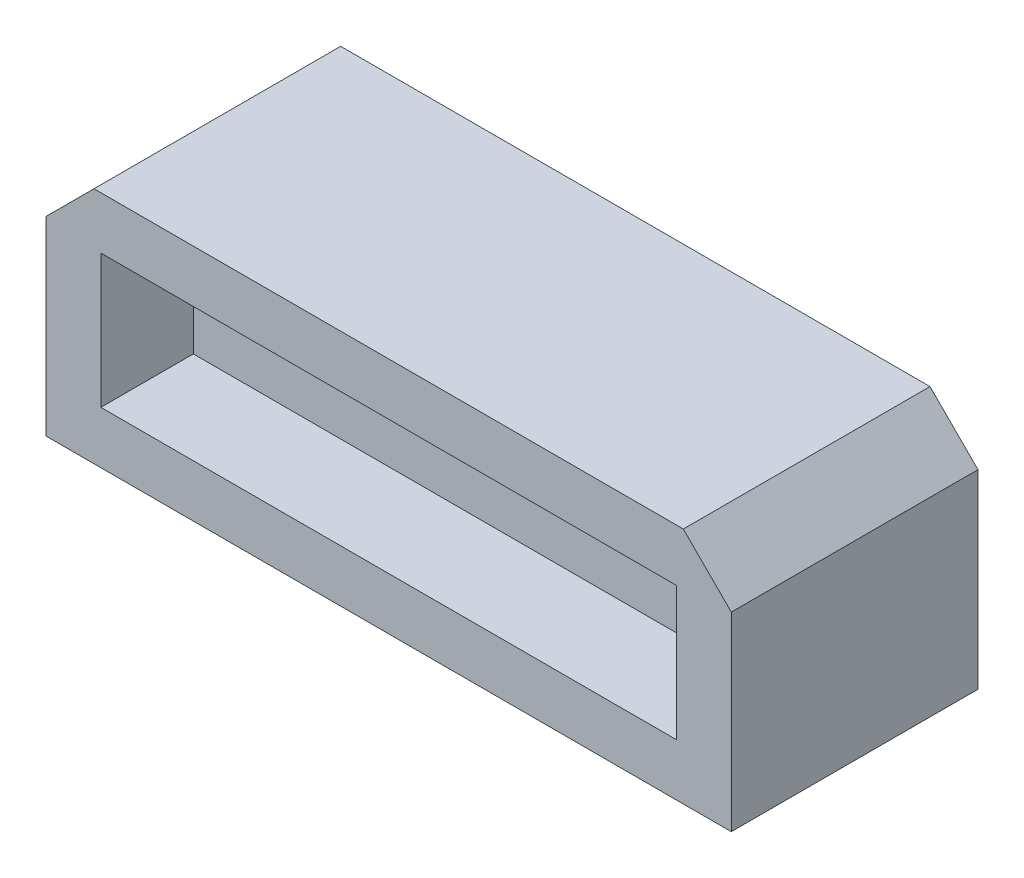
ISO-10303-21;
HEADER;
FILE_DESCRIPTION(('STEP AP214'),'2;1');
FILE_NAME('part.step','',(''),(''),'','','');
FILE_SCHEMA(('AUTOMOTIVE_DESIGN { 1 0 10303 214 1 1 1 1 }'));
ENDSEC;
DATA;
#1=APPLICATION_CONTEXT('core data for automotive mechanical design processes');
#2=APPLICATION_PROTOCOL_DEFINITION('international standard','automotive_design',2000,#1);
#3=PRODUCT_CONTEXT('',#1,'mechanical');
#4=PRODUCT('Part','Part','',(#3));
#5=PRODUCT_RELATED_PRODUCT_CATEGORY('part','',(#4));
#6=PRODUCT_DEFINITION_FORMATION('','',#4);
#7=PRODUCT_DEFINITION_CONTEXT('part definition',#1,'design');
#8=PRODUCT_DEFINITION('design','',#6,#7);
#9=PRODUCT_DEFINITION_SHAPE('','',#8);
#10=(LENGTH_UNIT() NAMED_UNIT(*) SI_UNIT(.MILLI.,.METRE.));
#11=(NAMED_UNIT(*) PLANE_ANGLE_UNIT() SI_UNIT($,.RADIAN.));
#12=(NAMED_UNIT(*) SI_UNIT($,.STERADIAN.) SOLID_ANGLE_UNIT());
#13=UNCERTAINTY_MEASURE_WITH_UNIT(LENGTH_MEASURE(1.E-05),#10,'distance_accuracy_value','');
#14=(GEOMETRIC_REPRESENTATION_CONTEXT(3) GLOBAL_UNCERTAINTY_ASSIGNED_CONTEXT((#13)) GLOBAL_UNIT_ASSIGNED_CONTEXT((#10,
#11,#12)) REPRESENTATION_CONTEXT('',''));
#15=CARTESIAN_POINT('',(0.,0.,0.));
#16=DIRECTION('',(0.,0.,1.));
#17=DIRECTION('',(1.,0.,0.));
#18=AXIS2_PLACEMENT_3D('',#15,#16,#17);
#19=CARTESIAN_POINT('',(8.6,3.475,0.));
#20=DIRECTION('',(0.707106781186548,0.707106781186548,0.));
#21=DIRECTION('',(-0.707106781186548,0.707106781186548,0.));
#22=AXIS2_PLACEMENT_3D('',#19,#20,#21);
#23=PLANE('',#22);
#24=DIRECTION('',(0.,0.,-1.));
#25=VECTOR('',#24,1.);
#26=CARTESIAN_POINT('',(10.,2.075,0.));
#27=LINE('',#26,#25);
#28=CARTESIAN_POINT('',(10.,2.075,1.));
#29=VERTEX_POINT('',#28);
#30=CARTESIAN_POINT('',(10.,2.075,8.2));
#31=VERTEX_POINT('',#30);
#32=EDGE_CURVE('E131',#29,#31,#27,.F.);
#33=ORIENTED_EDGE('',*,*,#32,.F.);
#34=DIRECTION('',(-0.707106781186548,0.707106781186548,0.));
#35=VECTOR('',#34,1.);
#36=CARTESIAN_POINT('',(8.6,3.475,1.));
#37=LINE('',#36,#35);
#38=CARTESIAN_POINT('',(8.6,3.475,1.));
#39=VERTEX_POINT('',#38);
#40=EDGE_CURVE('E174',#29,#39,#37,.T.);
#41=ORIENTED_EDGE('',*,*,#40,.T.);
#42=DIRECTION('',(0.,0.,1.));
#43=VECTOR('',#42,1.);
#44=CARTESIAN_POINT('',(8.6,3.475,0.));
#45=LINE('',#44,#43);
#46=CARTESIAN_POINT('',(8.6,3.475,8.2));
#47=VERTEX_POINT('',#46);
#48=EDGE_CURVE('E154',#47,#39,#45,.F.);
#49=ORIENTED_EDGE('',*,*,#48,.F.);
#50=DIRECTION('',(-0.707106781186547,0.707106781186547,0.));
#51=VECTOR('',#50,1.);
#52=CARTESIAN_POINT('',(10.,2.075,8.2));
#53=LINE('',#52,#51);
#54=EDGE_CURVE('E130',#31,#47,#53,.T.);
#55=ORIENTED_EDGE('',*,*,#54,.F.);
#56=EDGE_LOOP('',(#33,#41,#49,#55));
#57=FACE_BOUND('',#56,.T.);
#58=ADVANCED_FACE('F30',(#57),#23,.T.);
#59=CARTESIAN_POINT('',(10.,3.475,0.));
#60=DIRECTION('',(0.,1.,0.));
#61=DIRECTION('',(0.,0.,1.));
#62=AXIS2_PLACEMENT_3D('',#59,#60,#61);
#63=PLANE('',#62);
#64=ORIENTED_EDGE('',*,*,#48,.T.);
#65=DIRECTION('',(-1.,0.,0.));
#66=VECTOR('',#65,1.);
#67=CARTESIAN_POINT('',(10.,3.475,1.));
#68=LINE('',#67,#66);
#69=CARTESIAN_POINT('',(-8.6,3.475,1.));
#70=VERTEX_POINT('',#69);
#71=EDGE_CURVE('E177',#39,#70,#68,.T.);
#72=ORIENTED_EDGE('',*,*,#71,.T.);
#73=DIRECTION('',(0.,0.,1.));
#74=VECTOR('',#73,1.);
#75=CARTESIAN_POINT('',(-8.6,3.475,0.));
#76=LINE('',#75,#74);
#77=CARTESIAN_POINT('',(-8.6,3.475,8.2));
#78=VERTEX_POINT('',#77);
#79=EDGE_CURVE('E151',#78,#70,#76,.F.);
#80=ORIENTED_EDGE('',*,*,#79,.F.);
#81=DIRECTION('',(1.,0.,0.));
#82=VECTOR('',#81,1.);
#83=CARTESIAN_POINT('',(0.,3.475,8.2));
#84=LINE('',#83,#82);
#85=EDGE_CURVE('E134',#47,#78,#84,.F.);
#86=ORIENTED_EDGE('',*,*,#85,.F.);
#87=EDGE_LOOP('',(#64,#72,#80,#86));
#88=FACE_BOUND('',#87,.T.);
#89=ADVANCED_FACE('F206',(#88),#63,.T.);
#90=CARTESIAN_POINT('',(-10.,2.075,0.));
#91=DIRECTION('',(-0.707106781186548,0.707106781186548,0.));
#92=DIRECTION('',(-0.707106781186548,-0.707106781186548,0.));
#93=AXIS2_PLACEMENT_3D('',#90,#91,#92);
#94=PLANE('',#93);
#95=ORIENTED_EDGE('',*,*,#79,.T.);
#96=DIRECTION('',(-0.707106781186548,-0.707106781186548,0.));
#97=VECTOR('',#96,1.);
#98=CARTESIAN_POINT('',(-10.,2.075,1.));
#99=LINE('',#98,#97);
#100=CARTESIAN_POINT('',(-10.,2.075,1.));
#101=VERTEX_POINT('',#100);
#102=EDGE_CURVE('E180',#70,#101,#99,.T.);
#103=ORIENTED_EDGE('',*,*,#102,.T.);
#104=DIRECTION('',(0.,0.,1.));
#105=VECTOR('',#104,1.);
#106=CARTESIAN_POINT('',(-10.,2.075,0.));
#107=LINE('',#106,#105);
#108=CARTESIAN_POINT('',(-10.,2.075,8.2));
#109=VERTEX_POINT('',#108);
#110=EDGE_CURVE('E116',#109,#101,#107,.F.);
#111=ORIENTED_EDGE('',*,*,#110,.F.);
#112=DIRECTION('',(-0.707106781186547,-0.707106781186547,0.));
#113=VECTOR('',#112,1.);
#114=CARTESIAN_POINT('',(-8.6,3.475,8.2));
#115=LINE('',#114,#113);
#116=EDGE_CURVE('E137',#78,#109,#115,.T.);
#117=ORIENTED_EDGE('',*,*,#116,.F.);
#118=EDGE_LOOP('',(#95,#103,#111,#117));
#119=FACE_BOUND('',#118,.T.);
#120=ADVANCED_FACE('F211',(#119),#94,.T.);
#121=CARTESIAN_POINT('',(10.,-3.475,0.));
#122=DIRECTION('',(1.,0.,0.));
#123=DIRECTION('',(0.,0.,-1.));
#124=AXIS2_PLACEMENT_3D('',#121,#122,#123);
#125=PLANE('',#124);
#126=DIRECTION('',(0.,0.,-1.));
#127=VECTOR('',#126,1.);
#128=CARTESIAN_POINT('',(10.,-3.475,0.));
#129=LINE('',#128,#127);
#130=CARTESIAN_POINT('',(10.,-3.475,1.));
#131=VERTEX_POINT('',#130);
#132=CARTESIAN_POINT('',(10.,-3.475,8.2));
#133=VERTEX_POINT('',#132);
#134=EDGE_CURVE('E120',#131,#133,#129,.F.);
#135=ORIENTED_EDGE('',*,*,#134,.F.);
#136=DIRECTION('',(0.,1.,0.));
#137=VECTOR('',#136,1.);
#138=CARTESIAN_POINT('',(10.,-3.475,1.));
#139=LINE('',#138,#137);
#140=EDGE_CURVE('E45',#131,#29,#139,.T.);
#141=ORIENTED_EDGE('',*,*,#140,.T.);
#142=ORIENTED_EDGE('',*,*,#32,.T.);
#143=DIRECTION('',(0.,1.,0.));
#144=VECTOR('',#143,1.);
#145=CARTESIAN_POINT('',(10.,0.,8.2));
#146=LINE('',#145,#144);
#147=EDGE_CURVE('E127',#133,#31,#146,.T.);
#148=ORIENTED_EDGE('',*,*,#147,.F.);
#149=EDGE_LOOP('',(#135,#141,#142,#148));
#150=FACE_BOUND('',#149,.T.);
#151=ADVANCED_FACE('F184',(#150),#125,.T.);
#152=CARTESIAN_POINT('',(-10.,3.475,0.));
#153=DIRECTION('',(-1.,0.,0.));
#154=DIRECTION('',(0.,0.,1.));
#155=AXIS2_PLACEMENT_3D('',#152,#153,#154);
#156=PLANE('',#155);
#157=ORIENTED_EDGE('',*,*,#110,.T.);
#158=DIRECTION('',(0.,-1.,0.));
#159=VECTOR('',#158,1.);
#160=CARTESIAN_POINT('',(-10.,3.475,1.));
#161=LINE('',#160,#159);
#162=CARTESIAN_POINT('',(-10.,-3.475,1.));
#163=VERTEX_POINT('',#162);
#164=EDGE_CURVE('E106',#101,#163,#161,.T.);
#165=ORIENTED_EDGE('',*,*,#164,.T.);
#166=DIRECTION('',(0.,0.,-1.));
#167=VECTOR('',#166,1.);
#168=CARTESIAN_POINT('',(-10.,-3.475,0.));
#169=LINE('',#168,#167);
#170=CARTESIAN_POINT('',(-10.,-3.475,8.2));
#171=VERTEX_POINT('',#170);
#172=EDGE_CURVE('E38',#171,#163,#169,.T.);
#173=ORIENTED_EDGE('',*,*,#172,.F.);
#174=DIRECTION('',(0.,1.,0.));
#175=VECTOR('',#174,1.);
#176=CARTESIAN_POINT('',(-10.,3.475,8.2));
#177=LINE('',#176,#175);
#178=EDGE_CURVE('E53',#171,#109,#177,.T.);
#179=ORIENTED_EDGE('',*,*,#178,.T.);
#180=EDGE_LOOP('',(#157,#165,#173,#179));
#181=FACE_BOUND('',#180,.T.);
#182=ADVANCED_FACE('F113',(#181),#156,.T.);
#183=CARTESIAN_POINT('',(-10.,-3.475,0.));
#184=DIRECTION('',(0.,-1.,0.));
#185=DIRECTION('',(0.,0.,-1.));
#186=AXIS2_PLACEMENT_3D('',#183,#184,#185);
#187=PLANE('',#186);
#188=ORIENTED_EDGE('',*,*,#172,.T.);
#189=DIRECTION('',(1.,0.,0.));
#190=VECTOR('',#189,1.);
#191=CARTESIAN_POINT('',(-10.,-3.475,1.));
#192=LINE('',#191,#190);
#193=EDGE_CURVE('E11',#163,#131,#192,.T.);
#194=ORIENTED_EDGE('',*,*,#193,.T.);
#195=ORIENTED_EDGE('',*,*,#134,.T.);
#196=DIRECTION('',(1.,0.,0.));
#197=VECTOR('',#196,1.);
#198=CARTESIAN_POINT('',(-10.,-3.475,8.2));
#199=LINE('',#198,#197);
#200=EDGE_CURVE('E118',#133,#171,#199,.F.);
#201=ORIENTED_EDGE('',*,*,#200,.T.);
#202=EDGE_LOOP('',(#188,#194,#195,#201));
#203=FACE_BOUND('',#202,.T.);
#204=ADVANCED_FACE('F32',(#203),#187,.T.);
#205=CARTESIAN_POINT('',(0.,0.,5.5));
#206=DIRECTION('',(0.,0.,1.));
#207=DIRECTION('',(1.,0.,0.));
#208=AXIS2_PLACEMENT_3D('',#205,#206,#207);
#209=PLANE('',#208);
#210=DIRECTION('',(1.,0.,0.));
#211=VECTOR('',#210,1.);
#212=CARTESIAN_POINT('',(8.4,1.95,5.5));
#213=LINE('',#212,#211);
#214=CARTESIAN_POINT('',(8.4,1.95,5.5));
#215=VERTEX_POINT('',#214);
#216=CARTESIAN_POINT('',(-8.4,1.95,5.5));
#217=VERTEX_POINT('',#216);
#218=EDGE_CURVE('E171',#215,#217,#213,.F.);
#219=ORIENTED_EDGE('',*,*,#218,.T.);
#220=DIRECTION('',(0.,1.,0.));
#221=VECTOR('',#220,1.);
#222=CARTESIAN_POINT('',(-8.4,1.95,5.5));
#223=LINE('',#222,#221);
#224=CARTESIAN_POINT('',(-8.4,-1.95,5.5));
#225=VERTEX_POINT('',#224);
#226=EDGE_CURVE('E161',#217,#225,#223,.F.);
#227=ORIENTED_EDGE('',*,*,#226,.T.);
#228=DIRECTION('',(1.,0.,0.));
#229=VECTOR('',#228,1.);
#230=CARTESIAN_POINT('',(-8.4,-1.95,5.5));
#231=LINE('',#230,#229);
#232=CARTESIAN_POINT('',(8.4,-1.95,5.5));
#233=VERTEX_POINT('',#232);
#234=EDGE_CURVE('E165',#225,#233,#231,.T.);
#235=ORIENTED_EDGE('',*,*,#234,.T.);
#236=DIRECTION('',(0.,1.,0.));
#237=VECTOR('',#236,1.);
#238=CARTESIAN_POINT('',(8.4,-1.95,5.5));
#239=LINE('',#238,#237);
#240=EDGE_CURVE('E169',#233,#215,#239,.T.);
#241=ORIENTED_EDGE('',*,*,#240,.T.);
#242=EDGE_LOOP('',(#219,#227,#235,#241));
#243=FACE_BOUND('',#242,.T.);
#244=ADVANCED_FACE('F199',(#243),#209,.T.);
#245=CARTESIAN_POINT('',(8.4,1.95,8.2));
#246=DIRECTION('',(0.,1.,0.));
#247=DIRECTION('',(0.,0.,1.));
#248=AXIS2_PLACEMENT_3D('',#245,#246,#247);
#249=PLANE('',#248);
#250=ORIENTED_EDGE('',*,*,#218,.F.);
#251=DIRECTION('',(0.,0.,-1.));
#252=VECTOR('',#251,1.);
#253=CARTESIAN_POINT('',(8.4,1.95,8.2));
#254=LINE('',#253,#252);
#255=CARTESIAN_POINT('',(8.4,1.95,8.2));
#256=VERTEX_POINT('',#255);
#257=EDGE_CURVE('E167',#215,#256,#254,.F.);
#258=ORIENTED_EDGE('',*,*,#257,.T.);
#259=DIRECTION('',(1.,0.,0.));
#260=VECTOR('',#259,1.);
#261=CARTESIAN_POINT('',(0.,1.95,8.2));
#262=LINE('',#261,#260);
#263=CARTESIAN_POINT('',(-8.4,1.95,8.2));
#264=VERTEX_POINT('',#263);
#265=EDGE_CURVE('E139',#264,#256,#262,.T.);
#266=ORIENTED_EDGE('',*,*,#265,.F.);
#267=DIRECTION('',(0.,0.,1.));
#268=VECTOR('',#267,1.);
#269=CARTESIAN_POINT('',(-8.4,1.95,8.2));
#270=LINE('',#269,#268);
#271=EDGE_CURVE('E158',#264,#217,#270,.F.);
#272=ORIENTED_EDGE('',*,*,#271,.T.);
#273=EDGE_LOOP('',(#250,#258,#266,#272));
#274=FACE_BOUND('',#273,.T.);
#275=ADVANCED_FACE('F235',(#274),#249,.F.);
#276=CARTESIAN_POINT('',(8.4,-1.95,8.2));
#277=DIRECTION('',(1.,0.,0.));
#278=DIRECTION('',(0.,0.,-1.));
#279=AXIS2_PLACEMENT_3D('',#276,#277,#278);
#280=PLANE('',#279);
#281=ORIENTED_EDGE('',*,*,#240,.F.);
#282=DIRECTION('',(0.,0.,-1.));
#283=VECTOR('',#282,1.);
#284=CARTESIAN_POINT('',(8.4,-1.95,8.2));
#285=LINE('',#284,#283);
#286=CARTESIAN_POINT('',(8.4,-1.95,8.2));
#287=VERTEX_POINT('',#286);
#288=EDGE_CURVE('E162',#233,#287,#285,.F.);
#289=ORIENTED_EDGE('',*,*,#288,.T.);
#290=DIRECTION('',(0.,1.,0.));
#291=VECTOR('',#290,1.);
#292=CARTESIAN_POINT('',(8.4,0.,8.2));
#293=LINE('',#292,#291);
#294=EDGE_CURVE('E142',#256,#287,#293,.F.);
#295=ORIENTED_EDGE('',*,*,#294,.F.);
#296=ORIENTED_EDGE('',*,*,#257,.F.);
#297=EDGE_LOOP('',(#281,#289,#295,#296));
#298=FACE_BOUND('',#297,.T.);
#299=ADVANCED_FACE('F243',(#298),#280,.F.);
#300=CARTESIAN_POINT('',(-8.4,-1.95,8.2));
#301=DIRECTION('',(0.,-1.,0.));
#302=DIRECTION('',(0.,0.,-1.));
#303=AXIS2_PLACEMENT_3D('',#300,#301,#302);
#304=PLANE('',#303);
#305=ORIENTED_EDGE('',*,*,#234,.F.);
#306=DIRECTION('',(0.,0.,1.));
#307=VECTOR('',#306,1.);
#308=CARTESIAN_POINT('',(-8.4,-1.95,8.2));
#309=LINE('',#308,#307);
#310=CARTESIAN_POINT('',(-8.4,-1.95,8.2));
#311=VERTEX_POINT('',#310);
#312=EDGE_CURVE('E157',#225,#311,#309,.T.);
#313=ORIENTED_EDGE('',*,*,#312,.T.);
#314=DIRECTION('',(1.,0.,0.));
#315=VECTOR('',#314,1.);
#316=CARTESIAN_POINT('',(0.,-1.95,8.2));
#317=LINE('',#316,#315);
#318=EDGE_CURVE('E145',#287,#311,#317,.F.);
#319=ORIENTED_EDGE('',*,*,#318,.F.);
#320=ORIENTED_EDGE('',*,*,#288,.F.);
#321=EDGE_LOOP('',(#305,#313,#319,#320));
#322=FACE_BOUND('',#321,.T.);
#323=ADVANCED_FACE('F200',(#322),#304,.F.);
#324=CARTESIAN_POINT('',(-8.4,1.95,8.2));
#325=DIRECTION('',(-1.,0.,0.));
#326=DIRECTION('',(0.,0.,1.));
#327=AXIS2_PLACEMENT_3D('',#324,#325,#326);
#328=PLANE('',#327);
#329=ORIENTED_EDGE('',*,*,#226,.F.);
#330=ORIENTED_EDGE('',*,*,#271,.F.);
#331=DIRECTION('',(0.,1.,0.));
#332=VECTOR('',#331,1.);
#333=CARTESIAN_POINT('',(-8.4,0.,8.2));
#334=LINE('',#333,#332);
#335=EDGE_CURVE('E125',#311,#264,#334,.T.);
#336=ORIENTED_EDGE('',*,*,#335,.F.);
#337=ORIENTED_EDGE('',*,*,#312,.F.);
#338=EDGE_LOOP('',(#329,#330,#336,#337));
#339=FACE_BOUND('',#338,.T.);
#340=ADVANCED_FACE('F191',(#339),#328,.F.);
#341=CARTESIAN_POINT('',(0.,0.,8.2));
#342=DIRECTION('',(0.,0.,1.));
#343=DIRECTION('',(1.,0.,0.));
#344=AXIS2_PLACEMENT_3D('',#341,#342,#343);
#345=PLANE('',#344);
#346=ORIENTED_EDGE('',*,*,#318,.T.);
#347=ORIENTED_EDGE('',*,*,#335,.T.);
#348=ORIENTED_EDGE('',*,*,#265,.T.);
#349=ORIENTED_EDGE('',*,*,#294,.T.);
#350=EDGE_LOOP('',(#346,#347,#348,#349));
#351=FACE_BOUND('',#350,.T.);
#352=ORIENTED_EDGE('',*,*,#116,.T.);
#353=ORIENTED_EDGE('',*,*,#178,.F.);
#354=ORIENTED_EDGE('',*,*,#200,.F.);
#355=ORIENTED_EDGE('',*,*,#147,.T.);
#356=ORIENTED_EDGE('',*,*,#54,.T.);
#357=ORIENTED_EDGE('',*,*,#85,.T.);
#358=EDGE_LOOP('',(#352,#353,#354,#355,#356,#357));
#359=FACE_BOUND('',#358,.T.);
#360=ADVANCED_FACE('F188',(#351,#359),#345,.T.);
#361=CARTESIAN_POINT('',(19.7965113655414,-7.55449561114574,1.));
#362=DIRECTION('',(0.,0.,-1.));
#363=DIRECTION('',(-1.,0.,0.));
#364=AXIS2_PLACEMENT_3D('',#361,#362,#363);
#365=PLANE('',#364);
#366=ORIENTED_EDGE('',*,*,#140,.F.);
#367=ORIENTED_EDGE('',*,*,#193,.F.);
#368=ORIENTED_EDGE('',*,*,#164,.F.);
#369=ORIENTED_EDGE('',*,*,#102,.F.);
#370=ORIENTED_EDGE('',*,*,#71,.F.);
#371=ORIENTED_EDGE('',*,*,#40,.F.);
#372=EDGE_LOOP('',(#366,#367,#368,#369,#370,#371));
#373=FACE_BOUND('',#372,.T.);
#374=ADVANCED_FACE('F105',(#373),#365,.T.);
#375=CLOSED_SHELL('',(#58,#89,#120,#151,#182,#204,#244,#275,#299,#323,#340,#360,#374));
#376=MANIFOLD_SOLID_BREP('B2',#375);
#377=ADVANCED_BREP_SHAPE_REPRESENTATION('',(#18,#376),#14);
#378=SHAPE_DEFINITION_REPRESENTATION(#9,#377);
ENDSEC;
END-ISO-10303-21;
